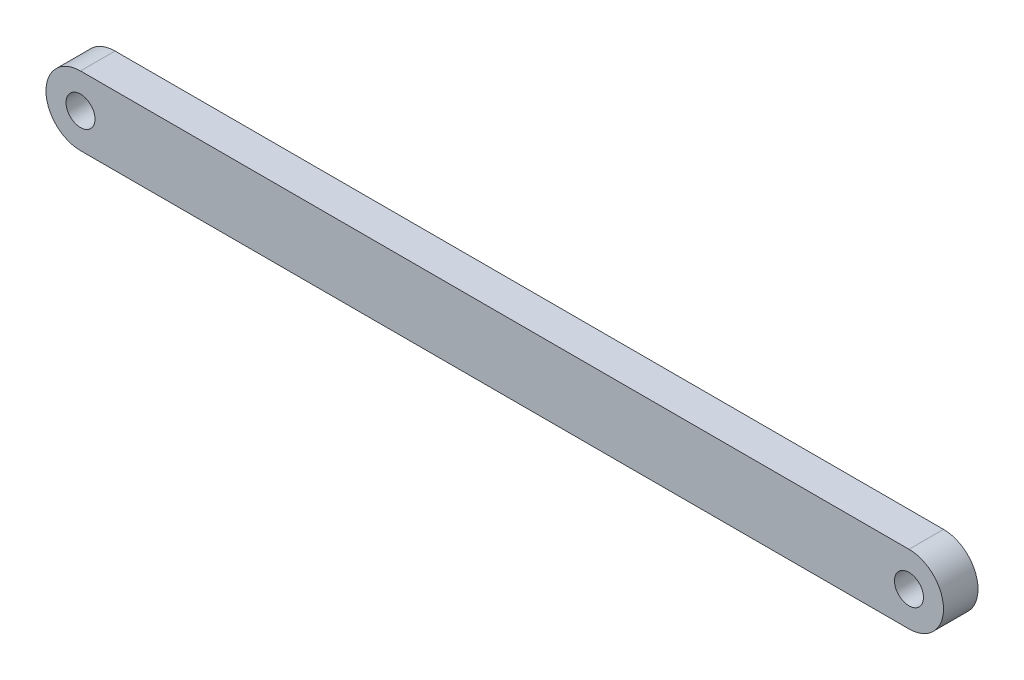
ISO-10303-21;
HEADER;
FILE_DESCRIPTION(('STEP AP214'),'2;1');
FILE_NAME('part.step','',(''),(''),'','','');
FILE_SCHEMA(('AUTOMOTIVE_DESIGN { 1 0 10303 214 1 1 1 1 }'));
ENDSEC;
DATA;
#1=APPLICATION_CONTEXT('core data for automotive mechanical design processes');
#2=APPLICATION_PROTOCOL_DEFINITION('international standard','automotive_design',2000,#1);
#3=PRODUCT_CONTEXT('',#1,'mechanical');
#4=PRODUCT('Part','Part','',(#3));
#5=PRODUCT_RELATED_PRODUCT_CATEGORY('part','',(#4));
#6=PRODUCT_DEFINITION_FORMATION('','',#4);
#7=PRODUCT_DEFINITION_CONTEXT('part definition',#1,'design');
#8=PRODUCT_DEFINITION('design','',#6,#7);
#9=PRODUCT_DEFINITION_SHAPE('','',#8);
#10=(LENGTH_UNIT() NAMED_UNIT(*) SI_UNIT(.MILLI.,.METRE.));
#11=(NAMED_UNIT(*) PLANE_ANGLE_UNIT() SI_UNIT($,.RADIAN.));
#12=(NAMED_UNIT(*) SI_UNIT($,.STERADIAN.) SOLID_ANGLE_UNIT());
#13=UNCERTAINTY_MEASURE_WITH_UNIT(LENGTH_MEASURE(1.E-05),#10,'distance_accuracy_value','');
#14=(GEOMETRIC_REPRESENTATION_CONTEXT(3) GLOBAL_UNCERTAINTY_ASSIGNED_CONTEXT((#13)) GLOBAL_UNIT_ASSIGNED_CONTEXT((#10,
#11,#12)) REPRESENTATION_CONTEXT('',''));
#15=CARTESIAN_POINT('',(0.,0.,0.));
#16=DIRECTION('',(0.,0.,1.));
#17=DIRECTION('',(1.,0.,0.));
#18=AXIS2_PLACEMENT_3D('',#15,#16,#17);
#19=CARTESIAN_POINT('',(60.,0.,3.));
#20=DIRECTION('',(0.,0.,-1.));
#21=DIRECTION('',(-1.,0.,0.));
#22=AXIS2_PLACEMENT_3D('',#19,#20,#21);
#23=CYLINDRICAL_SURFACE('',#22,5.);
#24=CARTESIAN_POINT('',(60.,0.,2.));
#25=DIRECTION('',(0.,0.,1.));
#26=DIRECTION('',(1.,0.,0.));
#27=AXIS2_PLACEMENT_3D('',#24,#25,#26);
#28=CIRCLE('',#27,5.);
#29=CARTESIAN_POINT('',(60.,-5.00000000000001,2.));
#30=VERTEX_POINT('',#29);
#31=CARTESIAN_POINT('',(60.,5.00000000000001,2.));
#32=VERTEX_POINT('',#31);
#33=EDGE_CURVE('E84',#30,#32,#28,.T.);
#34=ORIENTED_EDGE('',*,*,#33,.F.);
#35=DIRECTION('',(0.,0.,-1.));
#36=VECTOR('',#35,1.);
#37=CARTESIAN_POINT('',(60.,-5.,3.));
#38=LINE('',#37,#36);
#39=CARTESIAN_POINT('',(60.,-5.,-3.));
#40=VERTEX_POINT('',#39);
#41=EDGE_CURVE('E66',#30,#40,#38,.T.);
#42=ORIENTED_EDGE('',*,*,#41,.T.);
#43=CARTESIAN_POINT('',(60.,0.,-3.));
#44=DIRECTION('',(0.,0.,1.));
#45=DIRECTION('',(1.,0.,0.));
#46=AXIS2_PLACEMENT_3D('',#43,#44,#45);
#47=CIRCLE('',#46,5.);
#48=CARTESIAN_POINT('',(60.,5.00000000000002,-3.));
#49=VERTEX_POINT('',#48);
#50=EDGE_CURVE('E89',#40,#49,#47,.T.);
#51=ORIENTED_EDGE('',*,*,#50,.T.);
#52=DIRECTION('',(0.,0.,-1.));
#53=VECTOR('',#52,1.);
#54=CARTESIAN_POINT('',(60.,5.00000000000002,3.));
#55=LINE('',#54,#53);
#56=EDGE_CURVE('E52',#32,#49,#55,.T.);
#57=ORIENTED_EDGE('',*,*,#56,.F.);
#58=EDGE_LOOP('',(#34,#42,#51,#57));
#59=FACE_BOUND('',#58,.T.);
#60=ADVANCED_FACE('F45',(#59),#23,.T.);
#61=CARTESIAN_POINT('',(0.,5.00000000000001,3.));
#62=DIRECTION('',(0.,1.,0.));
#63=DIRECTION('',(0.,0.,1.));
#64=AXIS2_PLACEMENT_3D('',#61,#62,#63);
#65=PLANE('',#64);
#66=DIRECTION('',(0.,0.,-1.));
#67=VECTOR('',#66,1.);
#68=CARTESIAN_POINT('',(-60.,5.00000000000001,3.));
#69=LINE('',#68,#67);
#70=CARTESIAN_POINT('',(-60.,5.00000000000001,2.));
#71=VERTEX_POINT('',#70);
#72=CARTESIAN_POINT('',(-60.,5.00000000000001,-3.));
#73=VERTEX_POINT('',#72);
#74=EDGE_CURVE('E98',#71,#73,#69,.T.);
#75=ORIENTED_EDGE('',*,*,#74,.F.);
#76=DIRECTION('',(1.,0.,0.));
#77=VECTOR('',#76,1.);
#78=CARTESIAN_POINT('',(0.,5.00000000000001,2.));
#79=LINE('',#78,#77);
#80=EDGE_CURVE('E90',#71,#32,#79,.T.);
#81=ORIENTED_EDGE('',*,*,#80,.T.);
#82=ORIENTED_EDGE('',*,*,#56,.T.);
#83=DIRECTION('',(1.,0.,0.));
#84=VECTOR('',#83,1.);
#85=CARTESIAN_POINT('',(0.,5.00000000000001,-3.));
#86=LINE('',#85,#84);
#87=EDGE_CURVE('E109',#73,#49,#86,.T.);
#88=ORIENTED_EDGE('',*,*,#87,.F.);
#89=EDGE_LOOP('',(#75,#81,#82,#88));
#90=FACE_BOUND('',#89,.T.);
#91=ADVANCED_FACE('F107',(#90),#65,.T.);
#92=CARTESIAN_POINT('',(-60.,0.,3.));
#93=DIRECTION('',(0.,0.,-1.));
#94=DIRECTION('',(-1.,0.,0.));
#95=AXIS2_PLACEMENT_3D('',#92,#93,#94);
#96=CYLINDRICAL_SURFACE('',#95,5.00000000000001);
#97=DIRECTION('',(0.,0.,-1.));
#98=VECTOR('',#97,1.);
#99=CARTESIAN_POINT('',(-60.,-5.00000000000001,3.));
#100=LINE('',#99,#98);
#101=CARTESIAN_POINT('',(-60.,-5.00000000000001,2.));
#102=VERTEX_POINT('',#101);
#103=CARTESIAN_POINT('',(-60.,-5.00000000000001,-3.));
#104=VERTEX_POINT('',#103);
#105=EDGE_CURVE('E96',#102,#104,#100,.T.);
#106=ORIENTED_EDGE('',*,*,#105,.F.);
#107=CARTESIAN_POINT('',(-60.,0.,2.));
#108=DIRECTION('',(0.,0.,1.));
#109=DIRECTION('',(1.,0.,0.));
#110=AXIS2_PLACEMENT_3D('',#107,#108,#109);
#111=CIRCLE('',#110,5.00000000000001);
#112=EDGE_CURVE('E58',#102,#71,#111,.F.);
#113=ORIENTED_EDGE('',*,*,#112,.T.);
#114=ORIENTED_EDGE('',*,*,#74,.T.);
#115=CARTESIAN_POINT('',(-60.,0.,-3.));
#116=DIRECTION('',(0.,0.,1.));
#117=DIRECTION('',(1.,0.,0.));
#118=AXIS2_PLACEMENT_3D('',#115,#116,#117);
#119=CIRCLE('',#118,5.00000000000001);
#120=EDGE_CURVE('E100',#104,#73,#119,.F.);
#121=ORIENTED_EDGE('',*,*,#120,.F.);
#122=EDGE_LOOP('',(#106,#113,#114,#121));
#123=FACE_BOUND('',#122,.T.);
#124=ADVANCED_FACE('F158',(#123),#96,.T.);
#125=CARTESIAN_POINT('',(0.,-5.00000000000001,3.));
#126=DIRECTION('',(0.,1.,0.));
#127=DIRECTION('',(0.,0.,1.));
#128=AXIS2_PLACEMENT_3D('',#125,#126,#127);
#129=PLANE('',#128);
#130=DIRECTION('',(1.,0.,0.));
#131=VECTOR('',#130,1.);
#132=CARTESIAN_POINT('',(0.,-5.00000000000001,2.));
#133=LINE('',#132,#131);
#134=EDGE_CURVE('E11',#102,#30,#133,.T.);
#135=ORIENTED_EDGE('',*,*,#134,.F.);
#136=ORIENTED_EDGE('',*,*,#105,.T.);
#137=DIRECTION('',(1.,0.,0.));
#138=VECTOR('',#137,1.);
#139=CARTESIAN_POINT('',(0.,-5.00000000000001,-3.));
#140=LINE('',#139,#138);
#141=EDGE_CURVE('E94',#104,#40,#140,.T.);
#142=ORIENTED_EDGE('',*,*,#141,.T.);
#143=ORIENTED_EDGE('',*,*,#41,.F.);
#144=EDGE_LOOP('',(#135,#136,#142,#143));
#145=FACE_BOUND('',#144,.T.);
#146=ADVANCED_FACE('F92',(#145),#129,.F.);
#147=CARTESIAN_POINT('',(0.,0.,-3.));
#148=DIRECTION('',(0.,0.,1.));
#149=DIRECTION('',(1.,0.,0.));
#150=AXIS2_PLACEMENT_3D('',#147,#148,#149);
#151=PLANE('',#150);
#152=CARTESIAN_POINT('',(60.,0.,-3.));
#153=DIRECTION('',(0.,0.,-1.));
#154=DIRECTION('',(-1.,0.,0.));
#155=AXIS2_PLACEMENT_3D('',#152,#153,#154);
#156=CIRCLE('',#155,2.1);
#157=CARTESIAN_POINT('',(57.9,0.,-3.));
#158=VERTEX_POINT('',#157);
#159=EDGE_CURVE('E126',#158,#158,#156,.T.);
#160=ORIENTED_EDGE('',*,*,#159,.F.);
#161=EDGE_LOOP('',(#160));
#162=FACE_BOUND('',#161,.T.);
#163=CARTESIAN_POINT('',(-60.,0.,-3.));
#164=DIRECTION('',(0.,0.,-1.));
#165=DIRECTION('',(-1.,0.,0.));
#166=AXIS2_PLACEMENT_3D('',#163,#164,#165);
#167=CIRCLE('',#166,2.1);
#168=CARTESIAN_POINT('',(-62.1,0.,-3.));
#169=VERTEX_POINT('',#168);
#170=EDGE_CURVE('E123',#169,#169,#167,.T.);
#171=ORIENTED_EDGE('',*,*,#170,.F.);
#172=EDGE_LOOP('',(#171));
#173=FACE_BOUND('',#172,.T.);
#174=ORIENTED_EDGE('',*,*,#50,.F.);
#175=ORIENTED_EDGE('',*,*,#141,.F.);
#176=ORIENTED_EDGE('',*,*,#120,.T.);
#177=ORIENTED_EDGE('',*,*,#87,.T.);
#178=EDGE_LOOP('',(#174,#175,#176,#177));
#179=FACE_BOUND('',#178,.T.);
#180=ADVANCED_FACE('F113',(#162,#173,#179),#151,.F.);
#181=CARTESIAN_POINT('',(0.,0.,2.));
#182=DIRECTION('',(0.,0.,1.));
#183=DIRECTION('',(1.,0.,0.));
#184=AXIS2_PLACEMENT_3D('',#181,#182,#183);
#185=PLANE('',#184);
#186=CARTESIAN_POINT('',(60.,0.,2.));
#187=DIRECTION('',(0.,0.,-1.));
#188=DIRECTION('',(-1.,0.,0.));
#189=AXIS2_PLACEMENT_3D('',#186,#187,#188);
#190=CIRCLE('',#189,2.1);
#191=CARTESIAN_POINT('',(57.9,0.,2.));
#192=VERTEX_POINT('',#191);
#193=EDGE_CURVE('E119',#192,#192,#190,.T.);
#194=ORIENTED_EDGE('',*,*,#193,.T.);
#195=EDGE_LOOP('',(#194));
#196=FACE_BOUND('',#195,.T.);
#197=CARTESIAN_POINT('',(-60.,0.,2.));
#198=DIRECTION('',(0.,0.,-1.));
#199=DIRECTION('',(-1.,0.,0.));
#200=AXIS2_PLACEMENT_3D('',#197,#198,#199);
#201=CIRCLE('',#200,2.1);
#202=CARTESIAN_POINT('',(-62.1,0.,2.));
#203=VERTEX_POINT('',#202);
#204=EDGE_CURVE('E120',#203,#203,#201,.T.);
#205=ORIENTED_EDGE('',*,*,#204,.T.);
#206=EDGE_LOOP('',(#205));
#207=FACE_BOUND('',#206,.T.);
#208=ORIENTED_EDGE('',*,*,#33,.T.);
#209=ORIENTED_EDGE('',*,*,#80,.F.);
#210=ORIENTED_EDGE('',*,*,#112,.F.);
#211=ORIENTED_EDGE('',*,*,#134,.T.);
#212=EDGE_LOOP('',(#208,#209,#210,#211));
#213=FACE_BOUND('',#212,.T.);
#214=ADVANCED_FACE('F83',(#196,#207,#213),#185,.T.);
#215=CARTESIAN_POINT('',(-60.,0.,2.));
#216=DIRECTION('',(0.,0.,-1.));
#217=DIRECTION('',(-1.,0.,0.));
#218=AXIS2_PLACEMENT_3D('',#215,#216,#217);
#219=CYLINDRICAL_SURFACE('',#218,2.1);
#220=ORIENTED_EDGE('',*,*,#204,.F.);
#221=EDGE_LOOP('',(#220));
#222=FACE_BOUND('',#221,.T.);
#223=ORIENTED_EDGE('',*,*,#170,.T.);
#224=EDGE_LOOP('',(#223));
#225=FACE_BOUND('',#224,.T.);
#226=ADVANCED_FACE('F137',(#222,#225),#219,.F.);
#227=CARTESIAN_POINT('',(60.,0.,2.));
#228=DIRECTION('',(0.,0.,-1.));
#229=DIRECTION('',(-1.,0.,0.));
#230=AXIS2_PLACEMENT_3D('',#227,#228,#229);
#231=CYLINDRICAL_SURFACE('',#230,2.1);
#232=ORIENTED_EDGE('',*,*,#193,.F.);
#233=EDGE_LOOP('',(#232));
#234=FACE_BOUND('',#233,.T.);
#235=ORIENTED_EDGE('',*,*,#159,.T.);
#236=EDGE_LOOP('',(#235));
#237=FACE_BOUND('',#236,.T.);
#238=ADVANCED_FACE('F134',(#234,#237),#231,.F.);
#239=CLOSED_SHELL('',(#60,#91,#124,#146,#180,#214,#226,#238));
#240=MANIFOLD_SOLID_BREP('B2',#239);
#241=ADVANCED_BREP_SHAPE_REPRESENTATION('',(#18,#240),#14);
#242=SHAPE_DEFINITION_REPRESENTATION(#9,#241);
ENDSEC;
END-ISO-10303-21;
